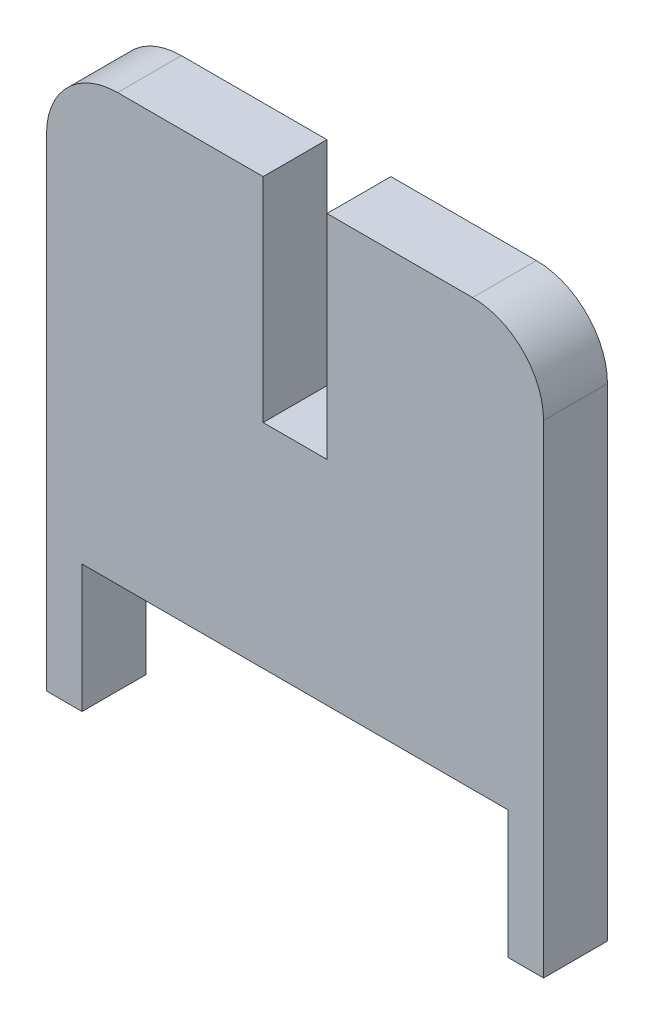
ISO-10303-21;
HEADER;
FILE_DESCRIPTION(('STEP AP214'),'2;1');
FILE_NAME('part.step','',(''),(''),'','','');
FILE_SCHEMA(('AUTOMOTIVE_DESIGN { 1 0 10303 214 1 1 1 1 }'));
ENDSEC;
DATA;
#1=APPLICATION_CONTEXT('core data for automotive mechanical design processes');
#2=APPLICATION_PROTOCOL_DEFINITION('international standard','automotive_design',2000,#1);
#3=PRODUCT_CONTEXT('',#1,'mechanical');
#4=PRODUCT('Part','Part','',(#3));
#5=PRODUCT_RELATED_PRODUCT_CATEGORY('part','',(#4));
#6=PRODUCT_DEFINITION_FORMATION('','',#4);
#7=PRODUCT_DEFINITION_CONTEXT('part definition',#1,'design');
#8=PRODUCT_DEFINITION('design','',#6,#7);
#9=PRODUCT_DEFINITION_SHAPE('','',#8);
#10=(LENGTH_UNIT() NAMED_UNIT(*) SI_UNIT(.MILLI.,.METRE.));
#11=(NAMED_UNIT(*) PLANE_ANGLE_UNIT() SI_UNIT($,.RADIAN.));
#12=(NAMED_UNIT(*) SI_UNIT($,.STERADIAN.) SOLID_ANGLE_UNIT());
#13=UNCERTAINTY_MEASURE_WITH_UNIT(LENGTH_MEASURE(1.E-05),#10,'distance_accuracy_value','');
#14=(GEOMETRIC_REPRESENTATION_CONTEXT(3) GLOBAL_UNCERTAINTY_ASSIGNED_CONTEXT((#13)) GLOBAL_UNIT_ASSIGNED_CONTEXT((#10,
#11,#12)) REPRESENTATION_CONTEXT('',''));
#15=CARTESIAN_POINT('',(0.,0.,0.));
#16=DIRECTION('',(0.,0.,1.));
#17=DIRECTION('',(1.,0.,0.));
#18=AXIS2_PLACEMENT_3D('',#15,#16,#17);
#19=CARTESIAN_POINT('',(0.,15.,4.5));
#20=DIRECTION('',(0.,-1.,0.));
#21=DIRECTION('',(1.,0.,0.));
#22=AXIS2_PLACEMENT_3D('',#19,#20,#21);
#23=PLANE('',#22);
#24=DIRECTION('',(0.,0.,1.));
#25=VECTOR('',#24,1.);
#26=CARTESIAN_POINT('',(-2.25,15.,0.));
#27=LINE('',#26,#25);
#28=CARTESIAN_POINT('',(-2.25,15.,0.));
#29=VERTEX_POINT('',#28);
#30=CARTESIAN_POINT('',(-2.25,15.,4.5));
#31=VERTEX_POINT('',#30);
#32=EDGE_CURVE('E168',#29,#31,#27,.T.);
#33=ORIENTED_EDGE('',*,*,#32,.F.);
#34=DIRECTION('',(-1.,0.,0.));
#35=VECTOR('',#34,1.);
#36=CARTESIAN_POINT('',(0.,15.,0.));
#37=LINE('',#36,#35);
#38=CARTESIAN_POINT('',(-12.5,15.,0.));
#39=VERTEX_POINT('',#38);
#40=EDGE_CURVE('E214',#29,#39,#37,.T.);
#41=ORIENTED_EDGE('',*,*,#40,.T.);
#42=DIRECTION('',(0.,0.,-1.));
#43=VECTOR('',#42,1.);
#44=CARTESIAN_POINT('',(-12.5,15.,4.5));
#45=LINE('',#44,#43);
#46=CARTESIAN_POINT('',(-12.5,15.,4.5));
#47=VERTEX_POINT('',#46);
#48=EDGE_CURVE('E238',#39,#47,#45,.F.);
#49=ORIENTED_EDGE('',*,*,#48,.T.);
#50=DIRECTION('',(-1.,0.,0.));
#51=VECTOR('',#50,1.);
#52=CARTESIAN_POINT('',(0.,15.,4.5));
#53=LINE('',#52,#51);
#54=EDGE_CURVE('E190',#31,#47,#53,.T.);
#55=ORIENTED_EDGE('',*,*,#54,.F.);
#56=EDGE_LOOP('',(#33,#41,#49,#55));
#57=FACE_BOUND('',#56,.T.);
#58=ADVANCED_FACE('F35',(#57),#23,.F.);
#59=CARTESIAN_POINT('',(0.,0.,4.5));
#60=DIRECTION('',(0.,0.,1.));
#61=DIRECTION('',(1.,0.,0.));
#62=AXIS2_PLACEMENT_3D('',#59,#60,#61);
#63=PLANE('',#62);
#64=DIRECTION('',(-1.,0.,0.));
#65=VECTOR('',#64,1.);
#66=CARTESIAN_POINT('',(0.,0.,4.5));
#67=LINE('',#66,#65);
#68=CARTESIAN_POINT('',(2.25,0.,4.5));
#69=VERTEX_POINT('',#68);
#70=CARTESIAN_POINT('',(-2.25,0.,4.5));
#71=VERTEX_POINT('',#70);
#72=EDGE_CURVE('E143',#69,#71,#67,.T.);
#73=ORIENTED_EDGE('',*,*,#72,.T.);
#74=DIRECTION('',(0.,1.,0.));
#75=VECTOR('',#74,1.);
#76=CARTESIAN_POINT('',(-2.25,0.,4.5));
#77=LINE('',#76,#75);
#78=EDGE_CURVE('E156',#71,#31,#77,.T.);
#79=ORIENTED_EDGE('',*,*,#78,.T.);
#80=ORIENTED_EDGE('',*,*,#54,.T.);
#81=CARTESIAN_POINT('',(-12.5,9.99999999999999,4.5));
#82=DIRECTION('',(0.,0.,1.));
#83=DIRECTION('',(1.,0.,0.));
#84=AXIS2_PLACEMENT_3D('',#81,#82,#83);
#85=CIRCLE('',#84,5.);
#86=CARTESIAN_POINT('',(-17.5,9.99999999999999,4.5));
#87=VERTEX_POINT('',#86);
#88=EDGE_CURVE('E43',#47,#87,#85,.T.);
#89=ORIENTED_EDGE('',*,*,#88,.T.);
#90=DIRECTION('',(0.,1.,0.));
#91=VECTOR('',#90,1.);
#92=CARTESIAN_POINT('',(-17.5,0.,4.5));
#93=LINE('',#92,#91);
#94=CARTESIAN_POINT('',(-17.5,-24.,4.5));
#95=VERTEX_POINT('',#94);
#96=EDGE_CURVE('E171',#95,#87,#93,.T.);
#97=ORIENTED_EDGE('',*,*,#96,.F.);
#98=DIRECTION('',(1.,0.,0.));
#99=VECTOR('',#98,1.);
#100=CARTESIAN_POINT('',(0.,-24.,4.5));
#101=LINE('',#100,#99);
#102=CARTESIAN_POINT('',(-15.,-24.,4.5));
#103=VERTEX_POINT('',#102);
#104=EDGE_CURVE('E174',#95,#103,#101,.T.);
#105=ORIENTED_EDGE('',*,*,#104,.T.);
#106=DIRECTION('',(0.,-1.,0.));
#107=VECTOR('',#106,1.);
#108=CARTESIAN_POINT('',(-15.,0.,4.5));
#109=LINE('',#108,#107);
#110=CARTESIAN_POINT('',(-15.,-15.,4.5));
#111=VERTEX_POINT('',#110);
#112=EDGE_CURVE('E177',#111,#103,#109,.T.);
#113=ORIENTED_EDGE('',*,*,#112,.F.);
#114=DIRECTION('',(-1.,0.,0.));
#115=VECTOR('',#114,1.);
#116=CARTESIAN_POINT('',(0.,-15.,4.5));
#117=LINE('',#116,#115);
#118=CARTESIAN_POINT('',(15.,-15.,4.5));
#119=VERTEX_POINT('',#118);
#120=EDGE_CURVE('E180',#119,#111,#117,.T.);
#121=ORIENTED_EDGE('',*,*,#120,.F.);
#122=DIRECTION('',(0.,-1.,0.));
#123=VECTOR('',#122,1.);
#124=CARTESIAN_POINT('',(15.,0.,4.5));
#125=LINE('',#124,#123);
#126=CARTESIAN_POINT('',(15.,-24.,4.5));
#127=VERTEX_POINT('',#126);
#128=EDGE_CURVE('E183',#119,#127,#125,.T.);
#129=ORIENTED_EDGE('',*,*,#128,.T.);
#130=DIRECTION('',(-1.,0.,0.));
#131=VECTOR('',#130,1.);
#132=CARTESIAN_POINT('',(0.,-24.,4.5));
#133=LINE('',#132,#131);
#134=CARTESIAN_POINT('',(17.5,-24.,4.5));
#135=VERTEX_POINT('',#134);
#136=EDGE_CURVE('E185',#135,#127,#133,.T.);
#137=ORIENTED_EDGE('',*,*,#136,.F.);
#138=DIRECTION('',(0.,1.,0.));
#139=VECTOR('',#138,1.);
#140=CARTESIAN_POINT('',(17.5,0.,4.5));
#141=LINE('',#140,#139);
#142=CARTESIAN_POINT('',(17.5,10.,4.5));
#143=VERTEX_POINT('',#142);
#144=EDGE_CURVE('E188',#135,#143,#141,.T.);
#145=ORIENTED_EDGE('',*,*,#144,.T.);
#146=CARTESIAN_POINT('',(12.5,10.,4.5));
#147=DIRECTION('',(0.,0.,1.));
#148=DIRECTION('',(1.,0.,0.));
#149=AXIS2_PLACEMENT_3D('',#146,#147,#148);
#150=CIRCLE('',#149,5.);
#151=CARTESIAN_POINT('',(12.5,15.,4.5));
#152=VERTEX_POINT('',#151);
#153=EDGE_CURVE('E241',#143,#152,#150,.T.);
#154=ORIENTED_EDGE('',*,*,#153,.T.);
#155=CARTESIAN_POINT('',(2.25,15.,4.5));
#156=VERTEX_POINT('',#155);
#157=EDGE_CURVE('E191',#152,#156,#53,.T.);
#158=ORIENTED_EDGE('',*,*,#157,.T.);
#159=DIRECTION('',(0.,1.,0.));
#160=VECTOR('',#159,1.);
#161=CARTESIAN_POINT('',(2.25,0.,4.5));
#162=LINE('',#161,#160);
#163=EDGE_CURVE('E159',#69,#156,#162,.T.);
#164=ORIENTED_EDGE('',*,*,#163,.F.);
#165=EDGE_LOOP('',(#73,#79,#80,#89,#97,#105,#113,#121,#129,#137,#145,#154,#158,#164));
#166=FACE_BOUND('',#165,.T.);
#167=ADVANCED_FACE('F245',(#166),#63,.T.);
#168=CARTESIAN_POINT('',(0.,0.,0.));
#169=DIRECTION('',(0.,0.,1.));
#170=DIRECTION('',(1.,0.,0.));
#171=AXIS2_PLACEMENT_3D('',#168,#169,#170);
#172=PLANE('',#171);
#173=DIRECTION('',(0.,1.,0.));
#174=VECTOR('',#173,1.);
#175=CARTESIAN_POINT('',(-2.25,0.,0.));
#176=LINE('',#175,#174);
#177=CARTESIAN_POINT('',(-2.25,0.,0.));
#178=VERTEX_POINT('',#177);
#179=EDGE_CURVE('E145',#178,#29,#176,.T.);
#180=ORIENTED_EDGE('',*,*,#179,.F.);
#181=DIRECTION('',(-1.,0.,0.));
#182=VECTOR('',#181,1.);
#183=CARTESIAN_POINT('',(0.,0.,0.));
#184=LINE('',#183,#182);
#185=CARTESIAN_POINT('',(2.25,0.,0.));
#186=VERTEX_POINT('',#185);
#187=EDGE_CURVE('E140',#186,#178,#184,.T.);
#188=ORIENTED_EDGE('',*,*,#187,.F.);
#189=DIRECTION('',(0.,1.,0.));
#190=VECTOR('',#189,1.);
#191=CARTESIAN_POINT('',(2.25,0.,0.));
#192=LINE('',#191,#190);
#193=CARTESIAN_POINT('',(2.25,15.,0.));
#194=VERTEX_POINT('',#193);
#195=EDGE_CURVE('E147',#186,#194,#192,.T.);
#196=ORIENTED_EDGE('',*,*,#195,.T.);
#197=CARTESIAN_POINT('',(12.5,15.,0.));
#198=VERTEX_POINT('',#197);
#199=EDGE_CURVE('E175',#198,#194,#37,.T.);
#200=ORIENTED_EDGE('',*,*,#199,.F.);
#201=CARTESIAN_POINT('',(12.5,10.,0.));
#202=DIRECTION('',(0.,0.,1.));
#203=DIRECTION('',(1.,0.,0.));
#204=AXIS2_PLACEMENT_3D('',#201,#202,#203);
#205=CIRCLE('',#204,5.);
#206=CARTESIAN_POINT('',(17.5,10.,0.));
#207=VERTEX_POINT('',#206);
#208=EDGE_CURVE('E230',#198,#207,#205,.F.);
#209=ORIENTED_EDGE('',*,*,#208,.T.);
#210=DIRECTION('',(0.,1.,0.));
#211=VECTOR('',#210,1.);
#212=CARTESIAN_POINT('',(17.5,0.,0.));
#213=LINE('',#212,#211);
#214=CARTESIAN_POINT('',(17.5,-24.,0.));
#215=VERTEX_POINT('',#214);
#216=EDGE_CURVE('E212',#215,#207,#213,.T.);
#217=ORIENTED_EDGE('',*,*,#216,.F.);
#218=DIRECTION('',(-1.,0.,0.));
#219=VECTOR('',#218,1.);
#220=CARTESIAN_POINT('',(0.,-24.,0.));
#221=LINE('',#220,#219);
#222=CARTESIAN_POINT('',(15.,-24.,0.));
#223=VERTEX_POINT('',#222);
#224=EDGE_CURVE('E209',#215,#223,#221,.T.);
#225=ORIENTED_EDGE('',*,*,#224,.T.);
#226=DIRECTION('',(0.,-1.,0.));
#227=VECTOR('',#226,1.);
#228=CARTESIAN_POINT('',(15.,0.,0.));
#229=LINE('',#228,#227);
#230=CARTESIAN_POINT('',(15.,-15.,0.));
#231=VERTEX_POINT('',#230);
#232=EDGE_CURVE('E206',#231,#223,#229,.T.);
#233=ORIENTED_EDGE('',*,*,#232,.F.);
#234=DIRECTION('',(-1.,0.,0.));
#235=VECTOR('',#234,1.);
#236=CARTESIAN_POINT('',(0.,-15.,0.));
#237=LINE('',#236,#235);
#238=CARTESIAN_POINT('',(-15.,-15.,0.));
#239=VERTEX_POINT('',#238);
#240=EDGE_CURVE('E203',#231,#239,#237,.T.);
#241=ORIENTED_EDGE('',*,*,#240,.T.);
#242=DIRECTION('',(0.,-1.,0.));
#243=VECTOR('',#242,1.);
#244=CARTESIAN_POINT('',(-15.,0.,0.));
#245=LINE('',#244,#243);
#246=CARTESIAN_POINT('',(-15.,-24.,0.));
#247=VERTEX_POINT('',#246);
#248=EDGE_CURVE('E200',#239,#247,#245,.T.);
#249=ORIENTED_EDGE('',*,*,#248,.T.);
#250=DIRECTION('',(1.,0.,0.));
#251=VECTOR('',#250,1.);
#252=CARTESIAN_POINT('',(0.,-24.,0.));
#253=LINE('',#252,#251);
#254=CARTESIAN_POINT('',(-17.5,-24.,0.));
#255=VERTEX_POINT('',#254);
#256=EDGE_CURVE('E197',#255,#247,#253,.T.);
#257=ORIENTED_EDGE('',*,*,#256,.F.);
#258=DIRECTION('',(0.,1.,0.));
#259=VECTOR('',#258,1.);
#260=CARTESIAN_POINT('',(-17.5,0.,0.));
#261=LINE('',#260,#259);
#262=CARTESIAN_POINT('',(-17.5,9.99999999999999,0.));
#263=VERTEX_POINT('',#262);
#264=EDGE_CURVE('E167',#255,#263,#261,.T.);
#265=ORIENTED_EDGE('',*,*,#264,.T.);
#266=CARTESIAN_POINT('',(-12.5,9.99999999999999,0.));
#267=DIRECTION('',(0.,0.,1.));
#268=DIRECTION('',(1.,0.,0.));
#269=AXIS2_PLACEMENT_3D('',#266,#267,#268);
#270=CIRCLE('',#269,5.);
#271=EDGE_CURVE('E232',#263,#39,#270,.F.);
#272=ORIENTED_EDGE('',*,*,#271,.T.);
#273=ORIENTED_EDGE('',*,*,#40,.F.);
#274=EDGE_LOOP('',(#180,#188,#196,#200,#209,#217,#225,#233,#241,#249,#257,#265,#272,#273));
#275=FACE_BOUND('',#274,.T.);
#276=ADVANCED_FACE('F154',(#275),#172,.F.);
#277=CARTESIAN_POINT('',(-17.5,0.,4.5));
#278=DIRECTION('',(-1.,0.,0.));
#279=DIRECTION('',(0.,0.,1.));
#280=AXIS2_PLACEMENT_3D('',#277,#278,#279);
#281=PLANE('',#280);
#282=ORIENTED_EDGE('',*,*,#96,.T.);
#283=DIRECTION('',(0.,0.,-1.));
#284=VECTOR('',#283,1.);
#285=CARTESIAN_POINT('',(-17.5,9.99999999999999,0.));
#286=LINE('',#285,#284);
#287=EDGE_CURVE('E227',#87,#263,#286,.T.);
#288=ORIENTED_EDGE('',*,*,#287,.T.);
#289=ORIENTED_EDGE('',*,*,#264,.F.);
#290=DIRECTION('',(0.,0.,-1.));
#291=VECTOR('',#290,1.);
#292=CARTESIAN_POINT('',(-17.5,-24.,4.5));
#293=LINE('',#292,#291);
#294=EDGE_CURVE('E225',#95,#255,#293,.T.);
#295=ORIENTED_EDGE('',*,*,#294,.F.);
#296=EDGE_LOOP('',(#282,#288,#289,#295));
#297=FACE_BOUND('',#296,.T.);
#298=ADVANCED_FACE('F251',(#297),#281,.T.);
#299=CARTESIAN_POINT('',(0.,-24.,4.5));
#300=DIRECTION('',(0.,1.,0.));
#301=DIRECTION('',(-1.,0.,0.));
#302=AXIS2_PLACEMENT_3D('',#299,#300,#301);
#303=PLANE('',#302);
#304=ORIENTED_EDGE('',*,*,#256,.T.);
#305=DIRECTION('',(0.,0.,-1.));
#306=VECTOR('',#305,1.);
#307=CARTESIAN_POINT('',(-15.,-24.,4.5));
#308=LINE('',#307,#306);
#309=EDGE_CURVE('E223',#103,#247,#308,.T.);
#310=ORIENTED_EDGE('',*,*,#309,.F.);
#311=ORIENTED_EDGE('',*,*,#104,.F.);
#312=ORIENTED_EDGE('',*,*,#294,.T.);
#313=EDGE_LOOP('',(#304,#310,#311,#312));
#314=FACE_BOUND('',#313,.T.);
#315=ADVANCED_FACE('F259',(#314),#303,.F.);
#316=CARTESIAN_POINT('',(-15.,0.,4.5));
#317=DIRECTION('',(1.,0.,0.));
#318=DIRECTION('',(0.,0.,-1.));
#319=AXIS2_PLACEMENT_3D('',#316,#317,#318);
#320=PLANE('',#319);
#321=ORIENTED_EDGE('',*,*,#248,.F.);
#322=DIRECTION('',(0.,0.,-1.));
#323=VECTOR('',#322,1.);
#324=CARTESIAN_POINT('',(-15.,-15.,4.5));
#325=LINE('',#324,#323);
#326=EDGE_CURVE('E221',#111,#239,#325,.T.);
#327=ORIENTED_EDGE('',*,*,#326,.F.);
#328=ORIENTED_EDGE('',*,*,#112,.T.);
#329=ORIENTED_EDGE('',*,*,#309,.T.);
#330=EDGE_LOOP('',(#321,#327,#328,#329));
#331=FACE_BOUND('',#330,.T.);
#332=ADVANCED_FACE('F321',(#331),#320,.T.);
#333=CARTESIAN_POINT('',(0.,-15.,4.5));
#334=DIRECTION('',(0.,-1.,0.));
#335=DIRECTION('',(1.,0.,0.));
#336=AXIS2_PLACEMENT_3D('',#333,#334,#335);
#337=PLANE('',#336);
#338=ORIENTED_EDGE('',*,*,#240,.F.);
#339=DIRECTION('',(0.,0.,-1.));
#340=VECTOR('',#339,1.);
#341=CARTESIAN_POINT('',(15.,-15.,4.5));
#342=LINE('',#341,#340);
#343=EDGE_CURVE('E219',#119,#231,#342,.T.);
#344=ORIENTED_EDGE('',*,*,#343,.F.);
#345=ORIENTED_EDGE('',*,*,#120,.T.);
#346=ORIENTED_EDGE('',*,*,#326,.T.);
#347=EDGE_LOOP('',(#338,#344,#345,#346));
#348=FACE_BOUND('',#347,.T.);
#349=ADVANCED_FACE('F265',(#348),#337,.T.);
#350=CARTESIAN_POINT('',(15.,0.,4.5));
#351=DIRECTION('',(1.,0.,0.));
#352=DIRECTION('',(0.,0.,-1.));
#353=AXIS2_PLACEMENT_3D('',#350,#351,#352);
#354=PLANE('',#353);
#355=ORIENTED_EDGE('',*,*,#232,.T.);
#356=DIRECTION('',(0.,0.,-1.));
#357=VECTOR('',#356,1.);
#358=CARTESIAN_POINT('',(15.,-24.,4.5));
#359=LINE('',#358,#357);
#360=EDGE_CURVE('E217',#127,#223,#359,.T.);
#361=ORIENTED_EDGE('',*,*,#360,.F.);
#362=ORIENTED_EDGE('',*,*,#128,.F.);
#363=ORIENTED_EDGE('',*,*,#343,.T.);
#364=EDGE_LOOP('',(#355,#361,#362,#363));
#365=FACE_BOUND('',#364,.T.);
#366=ADVANCED_FACE('F270',(#365),#354,.F.);
#367=CARTESIAN_POINT('',(0.,-24.,4.5));
#368=DIRECTION('',(0.,-1.,0.));
#369=DIRECTION('',(1.,0.,0.));
#370=AXIS2_PLACEMENT_3D('',#367,#368,#369);
#371=PLANE('',#370);
#372=ORIENTED_EDGE('',*,*,#224,.F.);
#373=DIRECTION('',(0.,0.,-1.));
#374=VECTOR('',#373,1.);
#375=CARTESIAN_POINT('',(17.5,-24.,4.5));
#376=LINE('',#375,#374);
#377=EDGE_CURVE('E194',#135,#215,#376,.T.);
#378=ORIENTED_EDGE('',*,*,#377,.F.);
#379=ORIENTED_EDGE('',*,*,#136,.T.);
#380=ORIENTED_EDGE('',*,*,#360,.T.);
#381=EDGE_LOOP('',(#372,#378,#379,#380));
#382=FACE_BOUND('',#381,.T.);
#383=ADVANCED_FACE('F275',(#382),#371,.T.);
#384=CARTESIAN_POINT('',(17.5,0.,4.5));
#385=DIRECTION('',(-1.,0.,0.));
#386=DIRECTION('',(0.,0.,1.));
#387=AXIS2_PLACEMENT_3D('',#384,#385,#386);
#388=PLANE('',#387);
#389=ORIENTED_EDGE('',*,*,#216,.T.);
#390=DIRECTION('',(0.,0.,-1.));
#391=VECTOR('',#390,1.);
#392=CARTESIAN_POINT('',(17.5,10.,4.5));
#393=LINE('',#392,#391);
#394=EDGE_CURVE('E11',#207,#143,#393,.F.);
#395=ORIENTED_EDGE('',*,*,#394,.T.);
#396=ORIENTED_EDGE('',*,*,#144,.F.);
#397=ORIENTED_EDGE('',*,*,#377,.T.);
#398=EDGE_LOOP('',(#389,#395,#396,#397));
#399=FACE_BOUND('',#398,.T.);
#400=ADVANCED_FACE('F277',(#399),#388,.F.);
#401=ORIENTED_EDGE('',*,*,#199,.T.);
#402=DIRECTION('',(0.,0.,1.));
#403=VECTOR('',#402,1.);
#404=CARTESIAN_POINT('',(2.25,15.,0.));
#405=LINE('',#404,#403);
#406=EDGE_CURVE('E50',#194,#156,#405,.T.);
#407=ORIENTED_EDGE('',*,*,#406,.T.);
#408=ORIENTED_EDGE('',*,*,#157,.F.);
#409=DIRECTION('',(0.,0.,-1.));
#410=VECTOR('',#409,1.);
#411=CARTESIAN_POINT('',(12.5,15.,4.5));
#412=LINE('',#411,#410);
#413=EDGE_CURVE('E235',#152,#198,#412,.T.);
#414=ORIENTED_EDGE('',*,*,#413,.T.);
#415=EDGE_LOOP('',(#401,#407,#408,#414));
#416=FACE_BOUND('',#415,.T.);
#417=ADVANCED_FACE('F279',(#416),#23,.F.);
#418=CARTESIAN_POINT('',(-12.5,9.99999999999999,4.5));
#419=DIRECTION('',(0.,0.,1.));
#420=DIRECTION('',(1.,0.,0.));
#421=AXIS2_PLACEMENT_3D('',#418,#419,#420);
#422=CYLINDRICAL_SURFACE('',#421,5.);
#423=ORIENTED_EDGE('',*,*,#88,.F.);
#424=ORIENTED_EDGE('',*,*,#48,.F.);
#425=ORIENTED_EDGE('',*,*,#271,.F.);
#426=ORIENTED_EDGE('',*,*,#287,.F.);
#427=EDGE_LOOP('',(#423,#424,#425,#426));
#428=FACE_BOUND('',#427,.T.);
#429=ADVANCED_FACE('F254',(#428),#422,.T.);
#430=CARTESIAN_POINT('',(12.5,10.,4.5));
#431=DIRECTION('',(0.,0.,-1.));
#432=DIRECTION('',(-1.,0.,0.));
#433=AXIS2_PLACEMENT_3D('',#430,#431,#432);
#434=CYLINDRICAL_SURFACE('',#433,5.);
#435=ORIENTED_EDGE('',*,*,#153,.F.);
#436=ORIENTED_EDGE('',*,*,#394,.F.);
#437=ORIENTED_EDGE('',*,*,#208,.F.);
#438=ORIENTED_EDGE('',*,*,#413,.F.);
#439=EDGE_LOOP('',(#435,#436,#437,#438));
#440=FACE_BOUND('',#439,.T.);
#441=ADVANCED_FACE('F37',(#440),#434,.T.);
#442=CARTESIAN_POINT('',(0.,0.,0.));
#443=DIRECTION('',(0.,1.,0.));
#444=DIRECTION('',(0.,0.,1.));
#445=AXIS2_PLACEMENT_3D('',#442,#443,#444);
#446=PLANE('',#445);
#447=ORIENTED_EDGE('',*,*,#72,.F.);
#448=DIRECTION('',(0.,0.,1.));
#449=VECTOR('',#448,1.);
#450=CARTESIAN_POINT('',(2.25,0.,0.));
#451=LINE('',#450,#449);
#452=EDGE_CURVE('E136',#186,#69,#451,.T.);
#453=ORIENTED_EDGE('',*,*,#452,.F.);
#454=ORIENTED_EDGE('',*,*,#187,.T.);
#455=DIRECTION('',(0.,0.,1.));
#456=VECTOR('',#455,1.);
#457=CARTESIAN_POINT('',(-2.25,0.,0.));
#458=LINE('',#457,#456);
#459=EDGE_CURVE('E165',#178,#71,#458,.T.);
#460=ORIENTED_EDGE('',*,*,#459,.T.);
#461=EDGE_LOOP('',(#447,#453,#454,#460));
#462=FACE_BOUND('',#461,.T.);
#463=ADVANCED_FACE('F137',(#462),#446,.T.);
#464=CARTESIAN_POINT('',(-2.25,0.,0.));
#465=DIRECTION('',(1.,0.,0.));
#466=DIRECTION('',(0.,0.,-1.));
#467=AXIS2_PLACEMENT_3D('',#464,#465,#466);
#468=PLANE('',#467);
#469=ORIENTED_EDGE('',*,*,#78,.F.);
#470=ORIENTED_EDGE('',*,*,#459,.F.);
#471=ORIENTED_EDGE('',*,*,#179,.T.);
#472=ORIENTED_EDGE('',*,*,#32,.T.);
#473=EDGE_LOOP('',(#469,#470,#471,#472));
#474=FACE_BOUND('',#473,.T.);
#475=ADVANCED_FACE('F300',(#474),#468,.T.);
#476=CARTESIAN_POINT('',(2.25,0.,0.));
#477=DIRECTION('',(1.,0.,0.));
#478=DIRECTION('',(0.,0.,-1.));
#479=AXIS2_PLACEMENT_3D('',#476,#477,#478);
#480=PLANE('',#479);
#481=ORIENTED_EDGE('',*,*,#163,.T.);
#482=ORIENTED_EDGE('',*,*,#406,.F.);
#483=ORIENTED_EDGE('',*,*,#195,.F.);
#484=ORIENTED_EDGE('',*,*,#452,.T.);
#485=EDGE_LOOP('',(#481,#482,#483,#484));
#486=FACE_BOUND('',#485,.T.);
#487=ADVANCED_FACE('F148',(#486),#480,.F.);
#488=CLOSED_SHELL('',(#58,#167,#276,#298,#315,#332,#349,#366,#383,#400,#417,#429,#441,#463,#475,#487));
#489=MANIFOLD_SOLID_BREP('B2',#488);
#490=ADVANCED_BREP_SHAPE_REPRESENTATION('',(#18,#489),#14);
#491=SHAPE_DEFINITION_REPRESENTATION(#9,#490);
ENDSEC;
END-ISO-10303-21;
